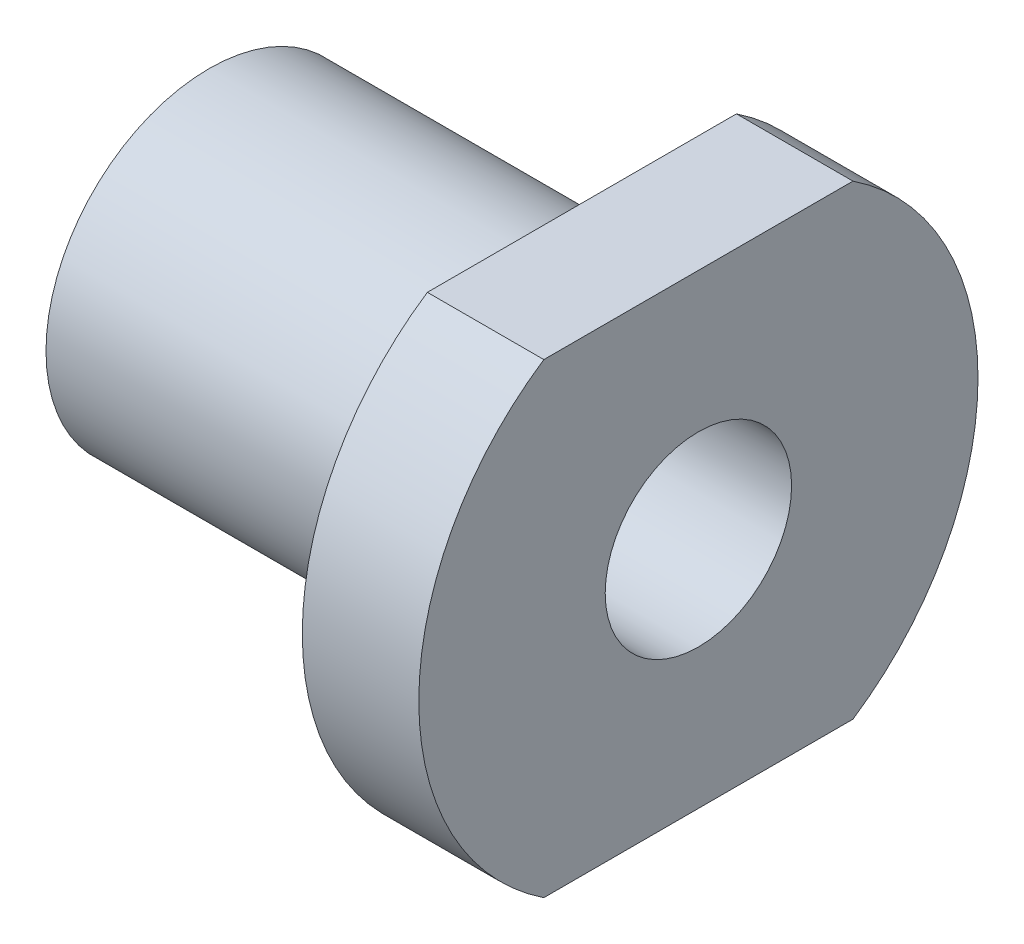
ISO-10303-21;
HEADER;
FILE_DESCRIPTION(('STEP AP214'),'2;1');
FILE_NAME('part.step','',(''),(''),'','','');
FILE_SCHEMA(('AUTOMOTIVE_DESIGN { 1 0 10303 214 1 1 1 1 }'));
ENDSEC;
DATA;
#1=APPLICATION_CONTEXT('core data for automotive mechanical design processes');
#2=APPLICATION_PROTOCOL_DEFINITION('international standard','automotive_design',2000,#1);
#3=PRODUCT_CONTEXT('',#1,'mechanical');
#4=PRODUCT('Part','Part','',(#3));
#5=PRODUCT_RELATED_PRODUCT_CATEGORY('part','',(#4));
#6=PRODUCT_DEFINITION_FORMATION('','',#4);
#7=PRODUCT_DEFINITION_CONTEXT('part definition',#1,'design');
#8=PRODUCT_DEFINITION('design','',#6,#7);
#9=PRODUCT_DEFINITION_SHAPE('','',#8);
#10=(LENGTH_UNIT() NAMED_UNIT(*) SI_UNIT(.MILLI.,.METRE.));
#11=(NAMED_UNIT(*) PLANE_ANGLE_UNIT() SI_UNIT($,.RADIAN.));
#12=(NAMED_UNIT(*) SI_UNIT($,.STERADIAN.) SOLID_ANGLE_UNIT());
#13=UNCERTAINTY_MEASURE_WITH_UNIT(LENGTH_MEASURE(1.E-05),#10,'distance_accuracy_value','');
#14=(GEOMETRIC_REPRESENTATION_CONTEXT(3) GLOBAL_UNCERTAINTY_ASSIGNED_CONTEXT((#13)) GLOBAL_UNIT_ASSIGNED_CONTEXT((#10,
#11,#12)) REPRESENTATION_CONTEXT('',''));
#15=CARTESIAN_POINT('',(0.,0.,0.));
#16=DIRECTION('',(0.,0.,1.));
#17=DIRECTION('',(1.,0.,0.));
#18=AXIS2_PLACEMENT_3D('',#15,#16,#17);
#19=CARTESIAN_POINT('',(0.,8.,0.));
#20=DIRECTION('',(1.,0.,0.));
#21=DIRECTION('',(0.,0.,-1.));
#22=AXIS2_PLACEMENT_3D('',#19,#20,#21);
#23=PLANE('',#22);
#24=CARTESIAN_POINT('',(0.,0.,0.));
#25=DIRECTION('',(1.,0.,0.));
#26=DIRECTION('',(0.,0.,-1.));
#27=AXIS2_PLACEMENT_3D('',#24,#25,#26);
#28=CIRCLE('',#27,8.);
#29=CARTESIAN_POINT('',(0.,0.,-8.));
#30=VERTEX_POINT('',#29);
#31=EDGE_CURVE('E96',#30,#30,#28,.T.);
#32=ORIENTED_EDGE('',*,*,#31,.F.);
#33=EDGE_LOOP('',(#32));
#34=FACE_BOUND('',#33,.T.);
#35=CARTESIAN_POINT('',(0.,0.,0.));
#36=DIRECTION('',(1.,0.,0.));
#37=DIRECTION('',(0.,0.,-1.));
#38=AXIS2_PLACEMENT_3D('',#35,#36,#37);
#39=CIRCLE('',#38,24.);
#40=CARTESIAN_POINT('',(0.,20.,13.2664991614216));
#41=VERTEX_POINT('',#40);
#42=CARTESIAN_POINT('',(0.,-20.,13.2664991614216));
#43=VERTEX_POINT('',#42);
#44=EDGE_CURVE('E93',#41,#43,#39,.T.);
#45=ORIENTED_EDGE('',*,*,#44,.T.);
#46=DIRECTION('',(0.,0.,-1.));
#47=VECTOR('',#46,1.);
#48=CARTESIAN_POINT('',(0.,-20.,30.));
#49=LINE('',#48,#47);
#50=CARTESIAN_POINT('',(0.,-20.,-13.2664991614216));
#51=VERTEX_POINT('',#50);
#52=EDGE_CURVE('E81',#43,#51,#49,.T.);
#53=ORIENTED_EDGE('',*,*,#52,.T.);
#54=CARTESIAN_POINT('',(0.,20.,-13.2664991614216));
#55=VERTEX_POINT('',#54);
#56=EDGE_CURVE('E88',#51,#55,#39,.T.);
#57=ORIENTED_EDGE('',*,*,#56,.T.);
#58=DIRECTION('',(0.,0.,1.));
#59=VECTOR('',#58,1.);
#60=CARTESIAN_POINT('',(0.,20.,30.));
#61=LINE('',#60,#59);
#62=EDGE_CURVE('E73',#55,#41,#61,.T.);
#63=ORIENTED_EDGE('',*,*,#62,.T.);
#64=EDGE_LOOP('',(#45,#53,#57,#63));
#65=FACE_BOUND('',#64,.T.);
#66=ADVANCED_FACE('F35',(#34,#65),#23,.T.);
#67=CARTESIAN_POINT('',(0.,0.,0.));
#68=DIRECTION('',(1.,0.,0.));
#69=DIRECTION('',(0.,0.,-1.));
#70=AXIS2_PLACEMENT_3D('',#67,#68,#69);
#71=CYLINDRICAL_SURFACE('',#70,24.);
#72=ORIENTED_EDGE('',*,*,#56,.F.);
#73=DIRECTION('',(1.,0.,0.));
#74=VECTOR('',#73,1.);
#75=CARTESIAN_POINT('',(0.,-20.,-13.2664991614216));
#76=LINE('',#75,#74);
#77=CARTESIAN_POINT('',(-10.,-20.,-13.2664991614216));
#78=VERTEX_POINT('',#77);
#79=EDGE_CURVE('E108',#51,#78,#76,.F.);
#80=ORIENTED_EDGE('',*,*,#79,.T.);
#81=CARTESIAN_POINT('',(-10.,0.,0.));
#82=DIRECTION('',(1.,0.,0.));
#83=DIRECTION('',(0.,0.,-1.));
#84=AXIS2_PLACEMENT_3D('',#81,#82,#83);
#85=CIRCLE('',#84,24.);
#86=CARTESIAN_POINT('',(-10.,20.,-13.2664991614216));
#87=VERTEX_POINT('',#86);
#88=EDGE_CURVE('E90',#78,#87,#85,.T.);
#89=ORIENTED_EDGE('',*,*,#88,.T.);
#90=DIRECTION('',(1.,0.,0.));
#91=VECTOR('',#90,1.);
#92=CARTESIAN_POINT('',(0.,20.,-13.2664991614216));
#93=LINE('',#92,#91);
#94=EDGE_CURVE('E57',#87,#55,#93,.T.);
#95=ORIENTED_EDGE('',*,*,#94,.T.);
#96=EDGE_LOOP('',(#72,#80,#89,#95));
#97=FACE_BOUND('',#96,.T.);
#98=ADVANCED_FACE('F86',(#97),#71,.T.);
#99=CARTESIAN_POINT('',(-10.,20.,13.2664991614216));
#100=VERTEX_POINT('',#99);
#101=CARTESIAN_POINT('',(-10.,-20.,13.2664991614216));
#102=VERTEX_POINT('',#101);
#103=EDGE_CURVE('E94',#100,#102,#85,.T.);
#104=ORIENTED_EDGE('',*,*,#103,.T.);
#105=DIRECTION('',(1.,0.,0.));
#106=VECTOR('',#105,1.);
#107=CARTESIAN_POINT('',(0.,-20.,13.2664991614216));
#108=LINE('',#107,#106);
#109=EDGE_CURVE('E50',#102,#43,#108,.T.);
#110=ORIENTED_EDGE('',*,*,#109,.T.);
#111=ORIENTED_EDGE('',*,*,#44,.F.);
#112=DIRECTION('',(1.,0.,0.));
#113=VECTOR('',#112,1.);
#114=CARTESIAN_POINT('',(0.,20.,13.2664991614216));
#115=LINE('',#114,#113);
#116=EDGE_CURVE('E76',#41,#100,#115,.F.);
#117=ORIENTED_EDGE('',*,*,#116,.T.);
#118=EDGE_LOOP('',(#104,#110,#111,#117));
#119=FACE_BOUND('',#118,.T.);
#120=ADVANCED_FACE('F106',(#119),#71,.T.);
#121=CARTESIAN_POINT('',(-10.,24.,0.));
#122=DIRECTION('',(-1.,0.,0.));
#123=DIRECTION('',(0.,0.,1.));
#124=AXIS2_PLACEMENT_3D('',#121,#122,#123);
#125=PLANE('',#124);
#126=CARTESIAN_POINT('',(-10.,0.,0.));
#127=DIRECTION('',(1.,0.,0.));
#128=DIRECTION('',(0.,0.,-1.));
#129=AXIS2_PLACEMENT_3D('',#126,#127,#128);
#130=CIRCLE('',#129,14.);
#131=CARTESIAN_POINT('',(-10.,0.,-14.));
#132=VERTEX_POINT('',#131);
#133=EDGE_CURVE('E118',#132,#132,#130,.T.);
#134=ORIENTED_EDGE('',*,*,#133,.T.);
#135=EDGE_LOOP('',(#134));
#136=FACE_BOUND('',#135,.T.);
#137=ORIENTED_EDGE('',*,*,#88,.F.);
#138=DIRECTION('',(0.,0.,1.));
#139=VECTOR('',#138,1.);
#140=CARTESIAN_POINT('',(-10.,-20.,0.));
#141=LINE('',#140,#139);
#142=EDGE_CURVE('E12',#78,#102,#141,.T.);
#143=ORIENTED_EDGE('',*,*,#142,.T.);
#144=ORIENTED_EDGE('',*,*,#103,.F.);
#145=DIRECTION('',(0.,0.,-1.));
#146=VECTOR('',#145,1.);
#147=CARTESIAN_POINT('',(-10.,20.,0.));
#148=LINE('',#147,#146);
#149=EDGE_CURVE('E43',#100,#87,#148,.T.);
#150=ORIENTED_EDGE('',*,*,#149,.T.);
#151=EDGE_LOOP('',(#137,#143,#144,#150));
#152=FACE_BOUND('',#151,.T.);
#153=ADVANCED_FACE('F104',(#136,#152),#125,.T.);
#154=CARTESIAN_POINT('',(0.,0.,0.));
#155=DIRECTION('',(1.,0.,0.));
#156=DIRECTION('',(0.,0.,-1.));
#157=AXIS2_PLACEMENT_3D('',#154,#155,#156);
#158=CYLINDRICAL_SURFACE('',#157,8.);
#159=ORIENTED_EDGE('',*,*,#31,.T.);
#160=EDGE_LOOP('',(#159));
#161=FACE_BOUND('',#160,.T.);
#162=CARTESIAN_POINT('',(-42.,0.,0.));
#163=DIRECTION('',(1.,0.,0.));
#164=DIRECTION('',(0.,0.,-1.));
#165=AXIS2_PLACEMENT_3D('',#162,#163,#164);
#166=CIRCLE('',#165,8.);
#167=CARTESIAN_POINT('',(-42.,0.,-8.));
#168=VERTEX_POINT('',#167);
#169=EDGE_CURVE('E113',#168,#168,#166,.T.);
#170=ORIENTED_EDGE('',*,*,#169,.F.);
#171=EDGE_LOOP('',(#170));
#172=FACE_BOUND('',#171,.T.);
#173=ADVANCED_FACE('F37',(#161,#172),#158,.F.);
#174=CARTESIAN_POINT('',(0.,0.,0.));
#175=DIRECTION('',(1.,0.,0.));
#176=DIRECTION('',(0.,0.,-1.));
#177=AXIS2_PLACEMENT_3D('',#174,#175,#176);
#178=CYLINDRICAL_SURFACE('',#177,14.);
#179=CARTESIAN_POINT('',(-42.,0.,0.));
#180=DIRECTION('',(1.,0.,0.));
#181=DIRECTION('',(0.,0.,-1.));
#182=AXIS2_PLACEMENT_3D('',#179,#180,#181);
#183=CIRCLE('',#182,14.);
#184=CARTESIAN_POINT('',(-42.,0.,-14.));
#185=VERTEX_POINT('',#184);
#186=EDGE_CURVE('E116',#185,#185,#183,.T.);
#187=ORIENTED_EDGE('',*,*,#186,.T.);
#188=EDGE_LOOP('',(#187));
#189=FACE_BOUND('',#188,.T.);
#190=ORIENTED_EDGE('',*,*,#133,.F.);
#191=EDGE_LOOP('',(#190));
#192=FACE_BOUND('',#191,.T.);
#193=ADVANCED_FACE('F123',(#189,#192),#178,.T.);
#194=CARTESIAN_POINT('',(-42.,14.,0.));
#195=DIRECTION('',(-1.,0.,0.));
#196=DIRECTION('',(0.,0.,1.));
#197=AXIS2_PLACEMENT_3D('',#194,#195,#196);
#198=PLANE('',#197);
#199=ORIENTED_EDGE('',*,*,#169,.T.);
#200=EDGE_LOOP('',(#199));
#201=FACE_BOUND('',#200,.T.);
#202=ORIENTED_EDGE('',*,*,#186,.F.);
#203=EDGE_LOOP('',(#202));
#204=FACE_BOUND('',#203,.T.);
#205=ADVANCED_FACE('F125',(#201,#204),#198,.T.);
#206=CARTESIAN_POINT('',(-10.,20.,30.));
#207=DIRECTION('',(0.,1.,0.));
#208=DIRECTION('',(0.,0.,1.));
#209=AXIS2_PLACEMENT_3D('',#206,#207,#208);
#210=PLANE('',#209);
#211=ORIENTED_EDGE('',*,*,#62,.F.);
#212=ORIENTED_EDGE('',*,*,#94,.F.);
#213=ORIENTED_EDGE('',*,*,#149,.F.);
#214=ORIENTED_EDGE('',*,*,#116,.F.);
#215=EDGE_LOOP('',(#211,#212,#213,#214));
#216=FACE_BOUND('',#215,.T.);
#217=ADVANCED_FACE('F74',(#216),#210,.T.);
#218=CARTESIAN_POINT('',(-10.,-20.,30.));
#219=DIRECTION('',(0.,-1.,0.));
#220=DIRECTION('',(0.,0.,-1.));
#221=AXIS2_PLACEMENT_3D('',#218,#219,#220);
#222=PLANE('',#221);
#223=ORIENTED_EDGE('',*,*,#52,.F.);
#224=ORIENTED_EDGE('',*,*,#109,.F.);
#225=ORIENTED_EDGE('',*,*,#142,.F.);
#226=ORIENTED_EDGE('',*,*,#79,.F.);
#227=EDGE_LOOP('',(#223,#224,#225,#226));
#228=FACE_BOUND('',#227,.T.);
#229=ADVANCED_FACE('F183',(#228),#222,.T.);
#230=CLOSED_SHELL('',(#66,#98,#120,#153,#173,#193,#205,#217,#229));
#231=MANIFOLD_SOLID_BREP('B2',#230);
#232=ADVANCED_BREP_SHAPE_REPRESENTATION('',(#18,#231),#14);
#233=SHAPE_DEFINITION_REPRESENTATION(#9,#232);
ENDSEC;
END-ISO-10303-21;
